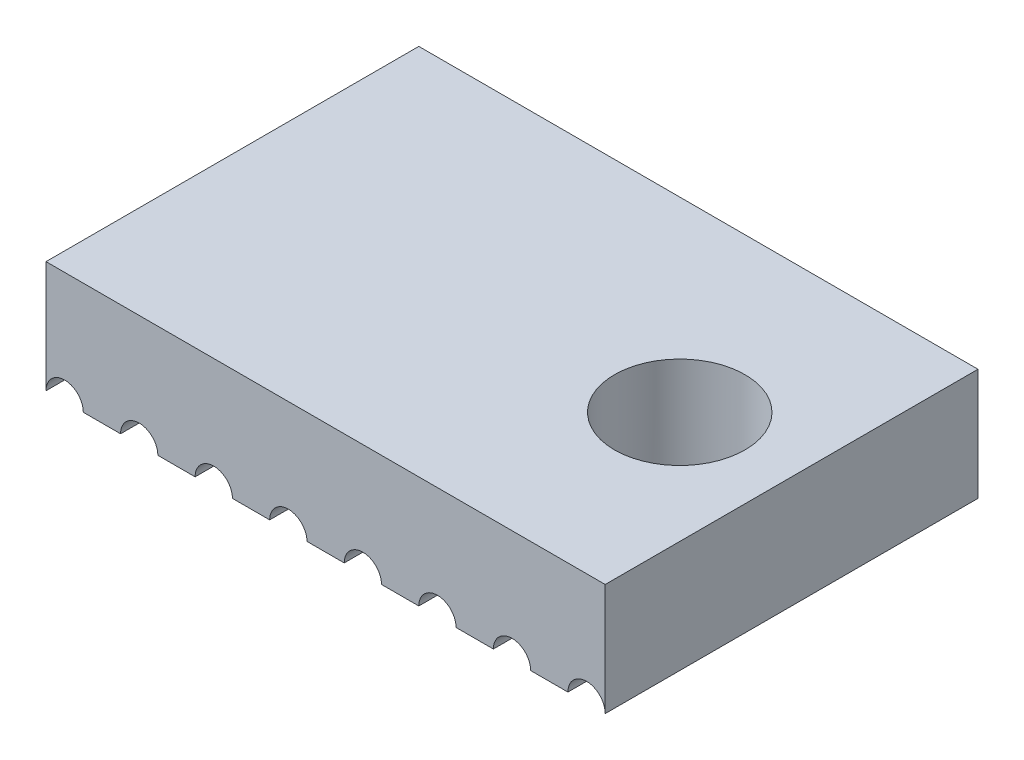
ISO-10303-21;
HEADER;
FILE_DESCRIPTION(('STEP AP214'),'2;1');
FILE_NAME('part.step','',(''),(''),'','','');
FILE_SCHEMA(('AUTOMOTIVE_DESIGN { 1 0 10303 214 1 1 1 1 }'));
ENDSEC;
DATA;
#1=APPLICATION_CONTEXT('core data for automotive mechanical design processes');
#2=APPLICATION_PROTOCOL_DEFINITION('international standard','automotive_design',2000,#1);
#3=PRODUCT_CONTEXT('',#1,'mechanical');
#4=PRODUCT('Part','Part','',(#3));
#5=PRODUCT_RELATED_PRODUCT_CATEGORY('part','',(#4));
#6=PRODUCT_DEFINITION_FORMATION('','',#4);
#7=PRODUCT_DEFINITION_CONTEXT('part definition',#1,'design');
#8=PRODUCT_DEFINITION('design','',#6,#7);
#9=PRODUCT_DEFINITION_SHAPE('','',#8);
#10=(LENGTH_UNIT() NAMED_UNIT(*) SI_UNIT(.MILLI.,.METRE.));
#11=(NAMED_UNIT(*) PLANE_ANGLE_UNIT() SI_UNIT($,.RADIAN.));
#12=(NAMED_UNIT(*) SI_UNIT($,.STERADIAN.) SOLID_ANGLE_UNIT());
#13=UNCERTAINTY_MEASURE_WITH_UNIT(LENGTH_MEASURE(1.E-05),#10,'distance_accuracy_value','');
#14=(GEOMETRIC_REPRESENTATION_CONTEXT(3) GLOBAL_UNCERTAINTY_ASSIGNED_CONTEXT((#13)) GLOBAL_UNIT_ASSIGNED_CONTEXT((#10,
#11,#12)) REPRESENTATION_CONTEXT('',''));
#15=CARTESIAN_POINT('',(0.,0.,0.));
#16=DIRECTION('',(0.,0.,1.));
#17=DIRECTION('',(1.,0.,0.));
#18=AXIS2_PLACEMENT_3D('',#15,#16,#17);
#19=CARTESIAN_POINT('',(0.,0.,0.));
#20=DIRECTION('',(0.,-1.,0.));
#21=DIRECTION('',(0.,0.,-1.));
#22=AXIS2_PLACEMENT_3D('',#19,#20,#21);
#23=PLANE('',#22);
#24=DIRECTION('',(0.,0.,1.));
#25=VECTOR('',#24,1.);
#26=CARTESIAN_POINT('',(-2.5,0.,-5.));
#27=LINE('',#26,#25);
#28=CARTESIAN_POINT('',(-2.5,0.,-5.));
#29=VERTEX_POINT('',#28);
#30=CARTESIAN_POINT('',(-2.5,0.,5.));
#31=VERTEX_POINT('',#30);
#32=EDGE_CURVE('E191',#29,#31,#27,.T.);
#33=ORIENTED_EDGE('',*,*,#32,.F.);
#34=DIRECTION('',(-1.,0.,0.));
#35=VECTOR('',#34,1.);
#36=CARTESIAN_POINT('',(-7.5,0.,-5.));
#37=LINE('',#36,#35);
#38=CARTESIAN_POINT('',(-1.5,0.,-5.));
#39=VERTEX_POINT('',#38);
#40=EDGE_CURVE('E201',#39,#29,#37,.T.);
#41=ORIENTED_EDGE('',*,*,#40,.F.);
#42=DIRECTION('',(0.,0.,1.));
#43=VECTOR('',#42,1.);
#44=CARTESIAN_POINT('',(-1.5,0.,-5.));
#45=LINE('',#44,#43);
#46=CARTESIAN_POINT('',(-1.5,0.,5.));
#47=VERTEX_POINT('',#46);
#48=EDGE_CURVE('E344',#39,#47,#45,.T.);
#49=ORIENTED_EDGE('',*,*,#48,.T.);
#50=DIRECTION('',(1.,0.,0.));
#51=VECTOR('',#50,1.);
#52=CARTESIAN_POINT('',(-7.5,0.,5.));
#53=LINE('',#52,#51);
#54=EDGE_CURVE('E222',#31,#47,#53,.T.);
#55=ORIENTED_EDGE('',*,*,#54,.F.);
#56=EDGE_LOOP('',(#33,#41,#49,#55));
#57=FACE_BOUND('',#56,.T.);
#58=ADVANCED_FACE('F33',(#57),#23,.T.);
#59=DIRECTION('',(0.,0.,1.));
#60=VECTOR('',#59,1.);
#61=CARTESIAN_POINT('',(-0.499999999999997,0.,-5.));
#62=LINE('',#61,#60);
#63=CARTESIAN_POINT('',(-0.499999999999997,0.,-5.));
#64=VERTEX_POINT('',#63);
#65=CARTESIAN_POINT('',(-0.499999999999997,0.,5.));
#66=VERTEX_POINT('',#65);
#67=EDGE_CURVE('E61',#64,#66,#62,.T.);
#68=ORIENTED_EDGE('',*,*,#67,.F.);
#69=CARTESIAN_POINT('',(0.500000000000003,0.,-5.));
#70=VERTEX_POINT('',#69);
#71=EDGE_CURVE('E208',#70,#64,#37,.T.);
#72=ORIENTED_EDGE('',*,*,#71,.F.);
#73=DIRECTION('',(0.,0.,1.));
#74=VECTOR('',#73,1.);
#75=CARTESIAN_POINT('',(0.500000000000003,0.,-5.));
#76=LINE('',#75,#74);
#77=CARTESIAN_POINT('',(0.500000000000003,0.,5.));
#78=VERTEX_POINT('',#77);
#79=EDGE_CURVE('E341',#70,#78,#76,.T.);
#80=ORIENTED_EDGE('',*,*,#79,.T.);
#81=EDGE_CURVE('E343',#66,#78,#53,.T.);
#82=ORIENTED_EDGE('',*,*,#81,.F.);
#83=EDGE_LOOP('',(#68,#72,#80,#82));
#84=FACE_BOUND('',#83,.T.);
#85=ADVANCED_FACE('F277',(#84),#23,.T.);
#86=DIRECTION('',(0.,0.,1.));
#87=VECTOR('',#86,1.);
#88=CARTESIAN_POINT('',(1.5,0.,-5.));
#89=LINE('',#88,#87);
#90=CARTESIAN_POINT('',(1.5,0.,-5.));
#91=VERTEX_POINT('',#90);
#92=CARTESIAN_POINT('',(1.5,0.,5.));
#93=VERTEX_POINT('',#92);
#94=EDGE_CURVE('E53',#91,#93,#89,.T.);
#95=ORIENTED_EDGE('',*,*,#94,.F.);
#96=CARTESIAN_POINT('',(2.5,0.,-5.));
#97=VERTEX_POINT('',#96);
#98=EDGE_CURVE('E330',#97,#91,#37,.T.);
#99=ORIENTED_EDGE('',*,*,#98,.F.);
#100=DIRECTION('',(0.,0.,1.));
#101=VECTOR('',#100,1.);
#102=CARTESIAN_POINT('',(2.5,0.,-5.));
#103=LINE('',#102,#101);
#104=CARTESIAN_POINT('',(2.5,0.,5.));
#105=VERTEX_POINT('',#104);
#106=EDGE_CURVE('E361',#97,#105,#103,.T.);
#107=ORIENTED_EDGE('',*,*,#106,.T.);
#108=EDGE_CURVE('E428',#93,#105,#53,.T.);
#109=ORIENTED_EDGE('',*,*,#108,.F.);
#110=EDGE_LOOP('',(#95,#99,#107,#109));
#111=FACE_BOUND('',#110,.T.);
#112=ADVANCED_FACE('F283',(#111),#23,.T.);
#113=DIRECTION('',(0.,0.,1.));
#114=VECTOR('',#113,1.);
#115=CARTESIAN_POINT('',(3.5,0.,-5.));
#116=LINE('',#115,#114);
#117=CARTESIAN_POINT('',(3.5,0.,-5.));
#118=VERTEX_POINT('',#117);
#119=CARTESIAN_POINT('',(3.5,0.,-1.43614066163451));
#120=VERTEX_POINT('',#119);
#121=EDGE_CURVE('E356',#118,#120,#116,.T.);
#122=ORIENTED_EDGE('',*,*,#121,.F.);
#123=CARTESIAN_POINT('',(4.5,0.,-5.));
#124=VERTEX_POINT('',#123);
#125=EDGE_CURVE('E329',#124,#118,#37,.T.);
#126=ORIENTED_EDGE('',*,*,#125,.F.);
#127=DIRECTION('',(0.,0.,1.));
#128=VECTOR('',#127,1.);
#129=CARTESIAN_POINT('',(4.5,0.,-5.));
#130=LINE('',#129,#128);
#131=CARTESIAN_POINT('',(4.5,0.,-1.75));
#132=VERTEX_POINT('',#131);
#133=EDGE_CURVE('E372',#124,#132,#130,.T.);
#134=ORIENTED_EDGE('',*,*,#133,.T.);
#135=CARTESIAN_POINT('',(4.5,0.,0.));
#136=DIRECTION('',(0.,1.,0.));
#137=DIRECTION('',(0.,0.,1.));
#138=AXIS2_PLACEMENT_3D('',#135,#136,#137);
#139=CIRCLE('',#138,1.75);
#140=EDGE_CURVE('E398',#132,#120,#139,.T.);
#141=ORIENTED_EDGE('',*,*,#140,.T.);
#142=EDGE_LOOP('',(#122,#126,#134,#141));
#143=FACE_BOUND('',#142,.T.);
#144=ADVANCED_FACE('F308',(#143),#23,.T.);
#145=CARTESIAN_POINT('',(3.5,0.,1.43614066163451));
#146=VERTEX_POINT('',#145);
#147=CARTESIAN_POINT('',(3.5,0.,5.));
#148=VERTEX_POINT('',#147);
#149=EDGE_CURVE('E364',#146,#148,#116,.T.);
#150=ORIENTED_EDGE('',*,*,#149,.F.);
#151=CARTESIAN_POINT('',(4.5,0.,1.75));
#152=VERTEX_POINT('',#151);
#153=EDGE_CURVE('E395',#146,#152,#139,.T.);
#154=ORIENTED_EDGE('',*,*,#153,.T.);
#155=CARTESIAN_POINT('',(4.5,0.,5.));
#156=VERTEX_POINT('',#155);
#157=EDGE_CURVE('E368',#152,#156,#130,.T.);
#158=ORIENTED_EDGE('',*,*,#157,.T.);
#159=EDGE_CURVE('E430',#148,#156,#53,.T.);
#160=ORIENTED_EDGE('',*,*,#159,.F.);
#161=EDGE_LOOP('',(#150,#154,#158,#160));
#162=FACE_BOUND('',#161,.T.);
#163=ADVANCED_FACE('F303',(#162),#23,.T.);
#164=DIRECTION('',(0.,0.,1.));
#165=VECTOR('',#164,1.);
#166=CARTESIAN_POINT('',(5.5,0.,-5.));
#167=LINE('',#166,#165);
#168=CARTESIAN_POINT('',(5.5,0.,-5.));
#169=VERTEX_POINT('',#168);
#170=CARTESIAN_POINT('',(5.5,0.,-1.43614066163451));
#171=VERTEX_POINT('',#170);
#172=EDGE_CURVE('E313',#169,#171,#167,.T.);
#173=ORIENTED_EDGE('',*,*,#172,.F.);
#174=CARTESIAN_POINT('',(6.5,0.,-5.));
#175=VERTEX_POINT('',#174);
#176=EDGE_CURVE('E211',#175,#169,#37,.T.);
#177=ORIENTED_EDGE('',*,*,#176,.F.);
#178=DIRECTION('',(0.,0.,1.));
#179=VECTOR('',#178,1.);
#180=CARTESIAN_POINT('',(6.5,0.,-5.));
#181=LINE('',#180,#179);
#182=CARTESIAN_POINT('',(6.5,0.,5.));
#183=VERTEX_POINT('',#182);
#184=EDGE_CURVE('E370',#175,#183,#181,.T.);
#185=ORIENTED_EDGE('',*,*,#184,.T.);
#186=CARTESIAN_POINT('',(5.5,0.,5.));
#187=VERTEX_POINT('',#186);
#188=EDGE_CURVE('E218',#187,#183,#53,.T.);
#189=ORIENTED_EDGE('',*,*,#188,.F.);
#190=CARTESIAN_POINT('',(5.5,0.,1.43614066163451));
#191=VERTEX_POINT('',#190);
#192=EDGE_CURVE('E321',#191,#187,#167,.T.);
#193=ORIENTED_EDGE('',*,*,#192,.F.);
#194=EDGE_CURVE('E318',#191,#171,#139,.T.);
#195=ORIENTED_EDGE('',*,*,#194,.T.);
#196=EDGE_LOOP('',(#173,#177,#185,#189,#193,#195));
#197=FACE_BOUND('',#196,.T.);
#198=ADVANCED_FACE('F297',(#197),#23,.T.);
#199=DIRECTION('',(0.,0.,1.));
#200=VECTOR('',#199,1.);
#201=CARTESIAN_POINT('',(-3.5,0.,-5.));
#202=LINE('',#201,#200);
#203=CARTESIAN_POINT('',(-3.5,0.,-5.));
#204=VERTEX_POINT('',#203);
#205=CARTESIAN_POINT('',(-3.5,0.,5.));
#206=VERTEX_POINT('',#205);
#207=EDGE_CURVE('E180',#204,#206,#202,.T.);
#208=ORIENTED_EDGE('',*,*,#207,.T.);
#209=CARTESIAN_POINT('',(-4.5,0.,5.));
#210=VERTEX_POINT('',#209);
#211=EDGE_CURVE('E219',#210,#206,#53,.T.);
#212=ORIENTED_EDGE('',*,*,#211,.F.);
#213=DIRECTION('',(0.,0.,1.));
#214=VECTOR('',#213,1.);
#215=CARTESIAN_POINT('',(-4.5,0.,-5.));
#216=LINE('',#215,#214);
#217=CARTESIAN_POINT('',(-4.5,0.,-5.));
#218=VERTEX_POINT('',#217);
#219=EDGE_CURVE('E205',#218,#210,#216,.T.);
#220=ORIENTED_EDGE('',*,*,#219,.F.);
#221=EDGE_CURVE('E197',#204,#218,#37,.T.);
#222=ORIENTED_EDGE('',*,*,#221,.F.);
#223=EDGE_LOOP('',(#208,#212,#220,#222));
#224=FACE_BOUND('',#223,.T.);
#225=ADVANCED_FACE('F204',(#224),#23,.T.);
#226=CARTESIAN_POINT('',(7.5,3.,5.));
#227=DIRECTION('',(-1.,0.,0.));
#228=DIRECTION('',(0.,0.,1.));
#229=AXIS2_PLACEMENT_3D('',#226,#227,#228);
#230=PLANE('',#229);
#231=DIRECTION('',(0.,0.,-1.));
#232=VECTOR('',#231,1.);
#233=CARTESIAN_POINT('',(7.5,0.,5.));
#234=LINE('',#233,#232);
#235=CARTESIAN_POINT('',(7.5,0.,5.));
#236=VERTEX_POINT('',#235);
#237=CARTESIAN_POINT('',(7.5,0.,-5.));
#238=VERTEX_POINT('',#237);
#239=EDGE_CURVE('E210',#236,#238,#234,.T.);
#240=ORIENTED_EDGE('',*,*,#239,.T.);
#241=DIRECTION('',(0.,-1.,0.));
#242=VECTOR('',#241,1.);
#243=CARTESIAN_POINT('',(7.5,3.,-5.));
#244=LINE('',#243,#242);
#245=CARTESIAN_POINT('',(7.5,3.,-5.));
#246=VERTEX_POINT('',#245);
#247=EDGE_CURVE('E233',#246,#238,#244,.T.);
#248=ORIENTED_EDGE('',*,*,#247,.F.);
#249=DIRECTION('',(0.,0.,-1.));
#250=VECTOR('',#249,1.);
#251=CARTESIAN_POINT('',(7.5,3.,5.));
#252=LINE('',#251,#250);
#253=CARTESIAN_POINT('',(7.5,3.,5.));
#254=VERTEX_POINT('',#253);
#255=EDGE_CURVE('E401',#254,#246,#252,.T.);
#256=ORIENTED_EDGE('',*,*,#255,.F.);
#257=DIRECTION('',(0.,-1.,0.));
#258=VECTOR('',#257,1.);
#259=CARTESIAN_POINT('',(7.5,3.,5.));
#260=LINE('',#259,#258);
#261=EDGE_CURVE('E223',#254,#236,#260,.T.);
#262=ORIENTED_EDGE('',*,*,#261,.T.);
#263=EDGE_LOOP('',(#240,#248,#256,#262));
#264=FACE_BOUND('',#263,.T.);
#265=ADVANCED_FACE('F35',(#264),#230,.F.);
#266=CARTESIAN_POINT('',(-7.5,3.,-5.));
#267=DIRECTION('',(0.,0.,1.));
#268=DIRECTION('',(1.,0.,0.));
#269=AXIS2_PLACEMENT_3D('',#266,#267,#268);
#270=PLANE('',#269);
#271=ORIENTED_EDGE('',*,*,#40,.T.);
#272=CARTESIAN_POINT('',(-3.,0.,-5.));
#273=DIRECTION('',(0.,0.,1.));
#274=DIRECTION('',(-1.,0.,0.));
#275=AXIS2_PLACEMENT_3D('',#272,#273,#274);
#276=CIRCLE('',#275,0.5);
#277=EDGE_CURVE('E183',#29,#204,#276,.T.);
#278=ORIENTED_EDGE('',*,*,#277,.T.);
#279=ORIENTED_EDGE('',*,*,#221,.T.);
#280=CARTESIAN_POINT('',(-5.,0.,-5.));
#281=DIRECTION('',(0.,0.,1.));
#282=DIRECTION('',(-1.,0.,0.));
#283=AXIS2_PLACEMENT_3D('',#280,#281,#282);
#284=CIRCLE('',#283,0.5);
#285=CARTESIAN_POINT('',(-5.5,0.,-5.));
#286=VERTEX_POINT('',#285);
#287=EDGE_CURVE('E387',#218,#286,#284,.T.);
#288=ORIENTED_EDGE('',*,*,#287,.T.);
#289=CARTESIAN_POINT('',(-6.5,0.,-5.));
#290=VERTEX_POINT('',#289);
#291=EDGE_CURVE('E206',#286,#290,#37,.T.);
#292=ORIENTED_EDGE('',*,*,#291,.T.);
#293=CARTESIAN_POINT('',(-7.,0.,-5.));
#294=DIRECTION('',(0.,0.,1.));
#295=DIRECTION('',(-1.,0.,0.));
#296=AXIS2_PLACEMENT_3D('',#293,#294,#295);
#297=CIRCLE('',#296,0.5);
#298=CARTESIAN_POINT('',(-7.5,0.,-5.));
#299=VERTEX_POINT('',#298);
#300=EDGE_CURVE('E379',#290,#299,#297,.T.);
#301=ORIENTED_EDGE('',*,*,#300,.T.);
#302=DIRECTION('',(0.,-1.,0.));
#303=VECTOR('',#302,1.);
#304=CARTESIAN_POINT('',(-7.5,3.,-5.));
#305=LINE('',#304,#303);
#306=CARTESIAN_POINT('',(-7.5,3.,-5.));
#307=VERTEX_POINT('',#306);
#308=EDGE_CURVE('E230',#307,#299,#305,.T.);
#309=ORIENTED_EDGE('',*,*,#308,.F.);
#310=DIRECTION('',(-1.,0.,0.));
#311=VECTOR('',#310,1.);
#312=CARTESIAN_POINT('',(-7.5,3.,-5.));
#313=LINE('',#312,#311);
#314=EDGE_CURVE('E404',#246,#307,#313,.T.);
#315=ORIENTED_EDGE('',*,*,#314,.F.);
#316=ORIENTED_EDGE('',*,*,#247,.T.);
#317=CARTESIAN_POINT('',(7.,0.,-5.));
#318=DIRECTION('',(0.,0.,1.));
#319=DIRECTION('',(-1.,0.,0.));
#320=AXIS2_PLACEMENT_3D('',#317,#318,#319);
#321=CIRCLE('',#320,0.5);
#322=EDGE_CURVE('E328',#238,#175,#321,.T.);
#323=ORIENTED_EDGE('',*,*,#322,.T.);
#324=ORIENTED_EDGE('',*,*,#176,.T.);
#325=CARTESIAN_POINT('',(5.,0.,-5.));
#326=DIRECTION('',(0.,0.,1.));
#327=DIRECTION('',(-1.,0.,0.));
#328=AXIS2_PLACEMENT_3D('',#325,#326,#327);
#329=CIRCLE('',#328,0.5);
#330=EDGE_CURVE('E326',#169,#124,#329,.T.);
#331=ORIENTED_EDGE('',*,*,#330,.T.);
#332=ORIENTED_EDGE('',*,*,#125,.T.);
#333=CARTESIAN_POINT('',(3.,0.,-5.));
#334=DIRECTION('',(0.,0.,1.));
#335=DIRECTION('',(-1.,0.,0.));
#336=AXIS2_PLACEMENT_3D('',#333,#334,#335);
#337=CIRCLE('',#336,0.5);
#338=EDGE_CURVE('E359',#118,#97,#337,.T.);
#339=ORIENTED_EDGE('',*,*,#338,.T.);
#340=ORIENTED_EDGE('',*,*,#98,.T.);
#341=CARTESIAN_POINT('',(1.,0.,-5.));
#342=DIRECTION('',(0.,0.,1.));
#343=DIRECTION('',(-1.,0.,0.));
#344=AXIS2_PLACEMENT_3D('',#341,#342,#343);
#345=CIRCLE('',#344,0.5);
#346=EDGE_CURVE('E338',#91,#70,#345,.T.);
#347=ORIENTED_EDGE('',*,*,#346,.T.);
#348=ORIENTED_EDGE('',*,*,#71,.T.);
#349=CARTESIAN_POINT('',(-0.999999999999997,0.,-5.));
#350=DIRECTION('',(0.,0.,1.));
#351=DIRECTION('',(-1.,0.,0.));
#352=AXIS2_PLACEMENT_3D('',#349,#350,#351);
#353=CIRCLE('',#352,0.5);
#354=EDGE_CURVE('E337',#64,#39,#353,.T.);
#355=ORIENTED_EDGE('',*,*,#354,.T.);
#356=EDGE_LOOP('',(#271,#278,#279,#288,#292,#301,#309,#315,#316,#323,#324,#331,#332,#339,#340,
#347,#348,#355));
#357=FACE_BOUND('',#356,.T.);
#358=ADVANCED_FACE('F195',(#357),#270,.F.);
#359=CARTESIAN_POINT('',(-7.5,3.,5.));
#360=DIRECTION('',(1.,0.,0.));
#361=DIRECTION('',(0.,0.,-1.));
#362=AXIS2_PLACEMENT_3D('',#359,#360,#361);
#363=PLANE('',#362);
#364=DIRECTION('',(0.,0.,1.));
#365=VECTOR('',#364,1.);
#366=CARTESIAN_POINT('',(-7.5,0.,5.));
#367=LINE('',#366,#365);
#368=CARTESIAN_POINT('',(-7.5,0.,5.));
#369=VERTEX_POINT('',#368);
#370=EDGE_CURVE('E215',#299,#369,#367,.T.);
#371=ORIENTED_EDGE('',*,*,#370,.T.);
#372=DIRECTION('',(0.,-1.,0.));
#373=VECTOR('',#372,1.);
#374=CARTESIAN_POINT('',(-7.5,3.,5.));
#375=LINE('',#374,#373);
#376=CARTESIAN_POINT('',(-7.5,3.,5.));
#377=VERTEX_POINT('',#376);
#378=EDGE_CURVE('E226',#377,#369,#375,.T.);
#379=ORIENTED_EDGE('',*,*,#378,.F.);
#380=DIRECTION('',(0.,0.,1.));
#381=VECTOR('',#380,1.);
#382=CARTESIAN_POINT('',(-7.5,3.,5.));
#383=LINE('',#382,#381);
#384=EDGE_CURVE('E406',#307,#377,#383,.T.);
#385=ORIENTED_EDGE('',*,*,#384,.F.);
#386=ORIENTED_EDGE('',*,*,#308,.T.);
#387=EDGE_LOOP('',(#371,#379,#385,#386));
#388=FACE_BOUND('',#387,.T.);
#389=ADVANCED_FACE('F420',(#388),#363,.F.);
#390=CARTESIAN_POINT('',(-7.5,3.,5.));
#391=DIRECTION('',(0.,0.,-1.));
#392=DIRECTION('',(-1.,0.,0.));
#393=AXIS2_PLACEMENT_3D('',#390,#391,#392);
#394=PLANE('',#393);
#395=ORIENTED_EDGE('',*,*,#211,.T.);
#396=CARTESIAN_POINT('',(-3.,0.,5.));
#397=DIRECTION('',(0.,0.,1.));
#398=DIRECTION('',(-1.,0.,0.));
#399=AXIS2_PLACEMENT_3D('',#396,#397,#398);
#400=CIRCLE('',#399,0.5);
#401=EDGE_CURVE('E186',#31,#206,#400,.T.);
#402=ORIENTED_EDGE('',*,*,#401,.F.);
#403=ORIENTED_EDGE('',*,*,#54,.T.);
#404=CARTESIAN_POINT('',(-0.999999999999997,0.,5.));
#405=DIRECTION('',(0.,0.,1.));
#406=DIRECTION('',(-1.,0.,0.));
#407=AXIS2_PLACEMENT_3D('',#404,#405,#406);
#408=CIRCLE('',#407,0.5);
#409=EDGE_CURVE('E350',#66,#47,#408,.T.);
#410=ORIENTED_EDGE('',*,*,#409,.F.);
#411=ORIENTED_EDGE('',*,*,#81,.T.);
#412=CARTESIAN_POINT('',(1.,0.,5.));
#413=DIRECTION('',(0.,0.,1.));
#414=DIRECTION('',(-1.,0.,0.));
#415=AXIS2_PLACEMENT_3D('',#412,#413,#414);
#416=CIRCLE('',#415,0.5);
#417=EDGE_CURVE('E354',#93,#78,#416,.T.);
#418=ORIENTED_EDGE('',*,*,#417,.F.);
#419=ORIENTED_EDGE('',*,*,#108,.T.);
#420=CARTESIAN_POINT('',(3.,0.,5.));
#421=DIRECTION('',(0.,0.,1.));
#422=DIRECTION('',(-1.,0.,0.));
#423=AXIS2_PLACEMENT_3D('',#420,#421,#422);
#424=CIRCLE('',#423,0.5);
#425=EDGE_CURVE('E320',#148,#105,#424,.T.);
#426=ORIENTED_EDGE('',*,*,#425,.F.);
#427=ORIENTED_EDGE('',*,*,#159,.T.);
#428=CARTESIAN_POINT('',(5.,0.,5.));
#429=DIRECTION('',(0.,0.,1.));
#430=DIRECTION('',(-1.,0.,0.));
#431=AXIS2_PLACEMENT_3D('',#428,#429,#430);
#432=CIRCLE('',#431,0.5);
#433=EDGE_CURVE('E369',#187,#156,#432,.T.);
#434=ORIENTED_EDGE('',*,*,#433,.F.);
#435=ORIENTED_EDGE('',*,*,#188,.T.);
#436=CARTESIAN_POINT('',(7.,0.,5.));
#437=DIRECTION('',(0.,0.,1.));
#438=DIRECTION('',(-1.,0.,0.));
#439=AXIS2_PLACEMENT_3D('',#436,#437,#438);
#440=CIRCLE('',#439,0.5);
#441=EDGE_CURVE('E376',#236,#183,#440,.T.);
#442=ORIENTED_EDGE('',*,*,#441,.F.);
#443=ORIENTED_EDGE('',*,*,#261,.F.);
#444=DIRECTION('',(1.,0.,0.));
#445=VECTOR('',#444,1.);
#446=CARTESIAN_POINT('',(-7.5,3.,5.));
#447=LINE('',#446,#445);
#448=EDGE_CURVE('E227',#377,#254,#447,.T.);
#449=ORIENTED_EDGE('',*,*,#448,.F.);
#450=ORIENTED_EDGE('',*,*,#378,.T.);
#451=CARTESIAN_POINT('',(-7.,0.,5.));
#452=DIRECTION('',(0.,0.,1.));
#453=DIRECTION('',(-1.,0.,0.));
#454=AXIS2_PLACEMENT_3D('',#451,#452,#453);
#455=CIRCLE('',#454,0.5);
#456=CARTESIAN_POINT('',(-6.5,0.,5.));
#457=VERTEX_POINT('',#456);
#458=EDGE_CURVE('E383',#457,#369,#455,.T.);
#459=ORIENTED_EDGE('',*,*,#458,.F.);
#460=CARTESIAN_POINT('',(-5.5,0.,5.));
#461=VERTEX_POINT('',#460);
#462=EDGE_CURVE('E221',#457,#461,#53,.T.);
#463=ORIENTED_EDGE('',*,*,#462,.T.);
#464=CARTESIAN_POINT('',(-5.,0.,5.));
#465=DIRECTION('',(0.,0.,1.));
#466=DIRECTION('',(-1.,0.,0.));
#467=AXIS2_PLACEMENT_3D('',#464,#465,#466);
#468=CIRCLE('',#467,0.5);
#469=EDGE_CURVE('E390',#210,#461,#468,.T.);
#470=ORIENTED_EDGE('',*,*,#469,.F.);
#471=EDGE_LOOP('',(#395,#402,#403,#410,#411,#418,#419,#426,#427,#434,#435,#442,#443,#449,#450,
#459,#463,#470));
#472=FACE_BOUND('',#471,.T.);
#473=ADVANCED_FACE('F293',(#472),#394,.F.);
#474=CARTESIAN_POINT('',(0.,3.,0.));
#475=DIRECTION('',(0.,-1.,0.));
#476=DIRECTION('',(0.,0.,-1.));
#477=AXIS2_PLACEMENT_3D('',#474,#475,#476);
#478=PLANE('',#477);
#479=CARTESIAN_POINT('',(4.5,3.,0.));
#480=DIRECTION('',(0.,1.,0.));
#481=DIRECTION('',(0.,0.,1.));
#482=AXIS2_PLACEMENT_3D('',#479,#480,#481);
#483=CIRCLE('',#482,1.75);
#484=CARTESIAN_POINT('',(4.5,3.,1.75));
#485=VERTEX_POINT('',#484);
#486=EDGE_CURVE('E386',#485,#485,#483,.T.);
#487=ORIENTED_EDGE('',*,*,#486,.F.);
#488=EDGE_LOOP('',(#487));
#489=FACE_BOUND('',#488,.T.);
#490=ORIENTED_EDGE('',*,*,#255,.T.);
#491=ORIENTED_EDGE('',*,*,#314,.T.);
#492=ORIENTED_EDGE('',*,*,#384,.T.);
#493=ORIENTED_EDGE('',*,*,#448,.T.);
#494=EDGE_LOOP('',(#490,#491,#492,#493));
#495=FACE_BOUND('',#494,.T.);
#496=ADVANCED_FACE('F287',(#489,#495),#478,.F.);
#497=DIRECTION('',(0.,0.,1.));
#498=VECTOR('',#497,1.);
#499=CARTESIAN_POINT('',(-6.5,0.,-5.));
#500=LINE('',#499,#498);
#501=EDGE_CURVE('E382',#290,#457,#500,.T.);
#502=ORIENTED_EDGE('',*,*,#501,.F.);
#503=ORIENTED_EDGE('',*,*,#291,.F.);
#504=DIRECTION('',(0.,0.,1.));
#505=VECTOR('',#504,1.);
#506=CARTESIAN_POINT('',(-5.5,0.,-5.));
#507=LINE('',#506,#505);
#508=EDGE_CURVE('E389',#286,#461,#507,.T.);
#509=ORIENTED_EDGE('',*,*,#508,.T.);
#510=ORIENTED_EDGE('',*,*,#462,.F.);
#511=EDGE_LOOP('',(#502,#503,#509,#510));
#512=FACE_BOUND('',#511,.T.);
#513=ADVANCED_FACE('F274',(#512),#23,.T.);
#514=CARTESIAN_POINT('',(4.5,0.,0.));
#515=DIRECTION('',(0.,1.,0.));
#516=DIRECTION('',(0.,0.,1.));
#517=AXIS2_PLACEMENT_3D('',#514,#515,#516);
#518=CYLINDRICAL_SURFACE('',#517,1.75);
#519=ORIENTED_EDGE('',*,*,#153,.F.);
#520=CARTESIAN_POINT('',(3.5,0.,1.43614066163451));
#521=CARTESIAN_POINT('',(3.50003507961647,0.0239539993863725,1.43614757630099));
#522=CARTESIAN_POINT('',(3.49828087523016,0.0478872725717558,1.4349435561475));
#523=CARTESIAN_POINT('',(3.4914656514043,0.0949479208351667,1.43017090494755));
#524=CARTESIAN_POINT('',(3.48641695766582,0.118077962669881,1.42661108696801));
#525=CARTESIAN_POINT('',(3.47328330587341,0.162947662814521,1.41718514143364));
#526=CARTESIAN_POINT('',(3.4651994703287,0.184687831677185,1.41131986648565));
#527=CARTESIAN_POINT('',(3.44645614951036,0.226267190948943,1.39738406063937));
#528=CARTESIAN_POINT('',(3.43579552319815,0.246105533752782,1.3893125525828));
#529=CARTESIAN_POINT('',(3.41203155641908,0.284167863781784,1.3707874269073));
#530=CARTESIAN_POINT('',(3.3988548583218,0.302309403158748,1.36025933459833));
#531=CARTESIAN_POINT('',(3.37097182461153,0.335943586754634,1.33720743573744));
#532=CARTESIAN_POINT('',(3.35626473592543,0.351434916853136,1.32468264502398));
#533=CARTESIAN_POINT('',(3.31970395307907,0.385544183378387,1.29236601406151));
#534=CARTESIAN_POINT('',(3.29739052472362,0.402843616781754,1.27169894754331));
#535=CARTESIAN_POINT('',(3.25231971467965,0.432511795270322,1.22751695273404));
#536=CARTESIAN_POINT('',(3.22956157232122,0.444871141439641,1.20399670576424));
#537=CARTESIAN_POINT('',(3.17491372572898,0.469740264420735,1.14407707669424));
#538=CARTESIAN_POINT('',(3.14331514020877,0.480019747038239,1.10649540064593));
#539=CARTESIAN_POINT('',(3.08292954580931,0.49405075793893,1.02804940864038));
#540=CARTESIAN_POINT('',(3.0541481204656,0.49778956057849,0.987178854951376));
#541=CARTESIAN_POINT('',(2.98334271271442,0.501652061824026,0.876821065195189));
#542=CARTESIAN_POINT('',(2.94423013438605,0.49807584827551,0.805359425704186));
#543=CARTESIAN_POINT('',(2.87638504854349,0.485703126952787,0.658031309648407));
#544=CARTESIAN_POINT('',(2.84768367629487,0.476891165337653,0.582152395534535));
#545=CARTESIAN_POINT('',(2.81180931696655,0.463423577627223,0.463035114286135));
#546=CARTESIAN_POINT('',(2.8008173417553,0.458729374923992,0.420920140533017));
#547=CARTESIAN_POINT('',(2.78199174502047,0.450089497091344,0.335919514072822));
#548=CARTESIAN_POINT('',(2.77415699880866,0.446143555677192,0.293034141498857));
#549=CARTESIAN_POINT('',(2.76172233932755,0.439628429555035,0.206833905299723));
#550=CARTESIAN_POINT('',(2.75711188625253,0.437054765662874,0.163520914874995));
#551=CARTESIAN_POINT('',(2.75113493288907,0.433679873403531,0.0766034779977167));
#552=CARTESIAN_POINT('',(2.74976810156258,0.432878464163879,0.0329990617430918));
#553=CARTESIAN_POINT('',(2.75031106684332,0.43319266427798,-0.0566700078088571));
#554=CARTESIAN_POINT('',(2.75241206625975,0.434420144065979,-0.102733228124655));
#555=CARTESIAN_POINT('',(2.76022875911997,0.438781456172238,-0.194463655426593));
#556=CARTESIAN_POINT('',(2.76594519761425,0.441915681417403,-0.240130778820375));
#557=CARTESIAN_POINT('',(2.78096677080576,0.449550095997173,-0.330993646664573));
#558=CARTESIAN_POINT('',(2.79029040593447,0.454057301247043,-0.37618570677213));
#559=CARTESIAN_POINT('',(2.81246193819923,0.463654145614783,-0.465662478024863));
#560=CARTESIAN_POINT('',(2.82531223279234,0.468744179568453,-0.509946549821853));
#561=CARTESIAN_POINT('',(2.85469879504666,0.478677116939054,-0.598057831398255));
#562=CARTESIAN_POINT('',(2.87128775932934,0.483515131943627,-0.641868062524535));
#563=CARTESIAN_POINT('',(2.90797882298523,0.491819046040461,-0.728123270665004));
#564=CARTESIAN_POINT('',(2.92807983462228,0.495285368885219,-0.770568665585074));
#565=CARTESIAN_POINT('',(2.97155197225611,0.499665002946768,-0.853536373831188));
#566=CARTESIAN_POINT('',(2.99489958929625,0.50059575654967,-0.894069931130388));
#567=CARTESIAN_POINT('',(3.0447096965446,0.498619488362253,-0.973036612425024));
#568=CARTESIAN_POINT('',(3.07116656530814,0.49571929845521,-1.01147334859766));
#569=CARTESIAN_POINT('',(3.12119759028914,0.485620347394703,-1.07832654763056));
#570=CARTESIAN_POINT('',(3.14431279367865,0.47938101782841,-1.10722525692944));
#571=CARTESIAN_POINT('',(3.19168196967994,0.462482835775616,-1.16281353008681));
#572=CARTESIAN_POINT('',(3.21593692466521,0.451820106339678,-1.1895011313111));
#573=CARTESIAN_POINT('',(3.26490918010095,0.424984968048738,-1.24028564843265));
#574=CARTESIAN_POINT('',(3.28962849785783,0.408746402884287,-1.26434666107518));
#575=CARTESIAN_POINT('',(3.33762799211964,0.370066369804627,-1.30860655665818));
#576=CARTESIAN_POINT('',(3.36091203926595,0.347642566033181,-1.32881616481152));
#577=CARTESIAN_POINT('',(3.39709739051154,0.304686388845402,-1.35885053858257));
#578=CARTESIAN_POINT('',(3.41094497889516,0.285822505069812,-1.36993353224594));
#579=CARTESIAN_POINT('',(3.43628013433742,0.245411537373223,-1.3896969298135));
#580=CARTESIAN_POINT('',(3.44776795019361,0.22386473670493,-1.39837758703643));
#581=CARTESIAN_POINT('',(3.46773344874301,0.178450078751333,-1.41318169599672));
#582=CARTESIAN_POINT('',(3.47619488614389,0.154570545902844,-1.4192913770176));
#583=CARTESIAN_POINT('',(3.48944612948598,0.105309113760723,-1.42875769520306));
#584=CARTESIAN_POINT('',(3.49424222580492,0.0799298692712932,-1.43211904968114));
#585=CARTESIAN_POINT('',(3.49803011984968,0.0452639360826711,-1.43476726697044));
#586=CARTESIAN_POINT('',(3.49876868899996,0.0362268467025018,-1.43528260197907));
#587=CARTESIAN_POINT('',(3.49975299102553,0.0181280594059881,-1.43596878697476));
#588=CARTESIAN_POINT('',(3.49999954883578,0.00906642823230691,-1.43614021358133));
#589=CARTESIAN_POINT('',(3.50000000000014,2.30414179921556E-13,-1.43614066163733));
#590=B_SPLINE_CURVE_WITH_KNOTS('',3,(#520,#521,#522,#523,#524,#525,#526,#527,#528,#529,#530,
#531,#532,#533,#534,#535,#536,#537,#538,#539,#540,#541,#542,#543,#544,#545,#546,#547,#548,#549,
#550,#551,#552,#553,#554,#555,#556,#557,#558,#559,#560,#561,#562,#563,#564,#565,#566,#567,#568,
#569,#570,#571,#572,#573,#574,#575,#576,#577,#578,#579,#580,#581,#582,#583,#584,#585,#586,#587,
#588,#589),.UNSPECIFIED.,.F.,.F.,(4,2,2,2,2,2,2,2,2,2,2,2,2,2,2,2,2,2,2,2,2,2,2,2,2,2,2,2,2,2,2,
2,2,2,4),(0.,0.071735343855141,0.143203830638911,0.214645911691552,0.286119686429231,
0.360134017378152,0.434184943018667,0.538568266450981,0.643149252934575,0.792797129428569,
0.942735840573528,1.18602409948264,1.43003404068719,1.56126304387972,1.69244525842933,
1.82319662487065,1.95393464649481,2.09212451375075,2.23034286772359,2.36927971368491,
2.5083112452166,2.6494408217447,2.79052676546146,2.93063968712127,3.07050307652451,
3.18281184672324,3.29521926014878,3.40900929369078,3.52247766521944,3.59984127316807,
3.67719672025997,3.75496138289668,3.8325922859601,3.85982274847988,3.88700751632492),.UNSPECIFIED.);
#591=EDGE_CURVE('E11',#146,#120,#590,.T.);
#592=ORIENTED_EDGE('',*,*,#591,.T.);
#593=ORIENTED_EDGE('',*,*,#140,.F.);
#594=CARTESIAN_POINT('',(4.5,0.,-1.75));
#595=CARTESIAN_POINT('',(4.49997614220782,0.0281049635425535,-1.74998073530025));
#596=CARTESIAN_POINT('',(4.50236824873608,0.056203041812045,-1.74999967376606));
#597=CARTESIAN_POINT('',(4.51180963843954,0.111590787503583,-1.74997160727267));
#598=CARTESIAN_POINT('',(4.51885638395479,0.138880886961437,-1.74992463822986));
#599=CARTESIAN_POINT('',(4.53743744327215,0.191904030204693,-1.7496226181094));
#600=CARTESIAN_POINT('',(4.54897407104744,0.217636263189751,-1.74936745966164));
#601=CARTESIAN_POINT('',(4.57619329413032,0.266789026562271,-1.74839370183821));
#602=CARTESIAN_POINT('',(4.59187487990076,0.290210117941483,-1.74767521524847));
#603=CARTESIAN_POINT('',(4.62686473258402,0.33399514955497,-1.74548281075504));
#604=CARTESIAN_POINT('',(4.64616035458693,0.354369316481896,-1.74401149668947));
#605=CARTESIAN_POINT('',(4.68782364195643,0.391568136085886,-1.74001701788163));
#606=CARTESIAN_POINT('',(4.71019131260827,0.408392782656111,-1.73749385132972));
#607=CARTESIAN_POINT('',(4.75695283252803,0.437813330890079,-1.73119127141581));
#608=CARTESIAN_POINT('',(4.78131410588169,0.45046488972168,-1.72742985264391));
#609=CARTESIAN_POINT('',(4.83154776020541,0.471556837411184,-1.71849532556794));
#610=CARTESIAN_POINT('',(4.85741994485742,0.479997772016448,-1.71332240034656));
#611=CARTESIAN_POINT('',(4.90980127883947,0.492531942306168,-1.70155264859417));
#612=CARTESIAN_POINT('',(4.9363085518384,0.496636677278,-1.69495964426312));
#613=CARTESIAN_POINT('',(4.9892706219407,0.500590248216291,-1.68043710179536));
#614=CARTESIAN_POINT('',(5.01572540674473,0.500438182876189,-1.67250728096331));
#615=CARTESIAN_POINT('',(5.06901908696108,0.495965151347929,-1.6551541678038));
#616=CARTESIAN_POINT('',(5.09582706962794,0.491468504802623,-1.6456819680523));
#617=CARTESIAN_POINT('',(5.14805125838233,0.478337332279808,-1.62582635470354));
#618=CARTESIAN_POINT('',(5.1734670472802,0.469701573438528,-1.61544267036739));
#619=CARTESIAN_POINT('',(5.22442381551795,0.447733782436832,-1.59328072596198));
#620=CARTESIAN_POINT('',(5.24980477666768,0.434075219848359,-1.58145788409754));
#621=CARTESIAN_POINT('',(5.2978651461368,0.402619262638526,-1.557764601255));
#622=CARTESIAN_POINT('',(5.32054208223713,0.384818123788934,-1.54589412682073));
#623=CARTESIAN_POINT('',(5.36385784498492,0.344290491383709,-1.52213433366046));
#624=CARTESIAN_POINT('',(5.38431235795515,0.321344602653604,-1.51028091790605));
#625=CARTESIAN_POINT('',(5.42095107175818,0.271572606097822,-1.4882227007187));
#626=CARTESIAN_POINT('',(5.43714058451909,0.244751389996869,-1.47801585473722));
#627=CARTESIAN_POINT('',(5.46119478741188,0.194622783332114,-1.46244963252657));
#628=CARTESIAN_POINT('',(5.47012401562914,0.172002439867457,-1.45651472189145));
#629=CARTESIAN_POINT('',(5.48465524233717,0.12531318830915,-1.44673140055051));
#630=CARTESIAN_POINT('',(5.49026520288839,0.101247900407821,-1.4428779987963));
#631=CARTESIAN_POINT('',(5.4960349728493,0.0641403653580868,-1.43889529245018));
#632=CARTESIAN_POINT('',(5.49751845365241,0.0513845851024514,-1.43786620600021));
#633=CARTESIAN_POINT('',(5.49950183701197,0.0257551592197413,-1.43648762711953));
#634=CARTESIAN_POINT('',(5.50000132354639,0.0128814660502882,-1.43613842213601));
#635=CARTESIAN_POINT('',(5.5,0.,-1.43614066163451));
#636=B_SPLINE_CURVE_WITH_KNOTS('',3,(#594,#595,#596,#597,#598,#599,#600,#601,#602,#603,#604,
#605,#606,#607,#608,#609,#610,#611,#612,#613,#614,#615,#616,#617,#618,#619,#620,#621,#622,#623,
#624,#625,#626,#627,#628,#629,#630,#631,#632,#633,#634,#635),.UNSPECIFIED.,.F.,.F.,(4,2,2,2,2,2,
2,2,2,2,2,2,2,2,2,2,2,2,2,2,4),(0.,0.0842035030145912,0.168361137018124,0.252562201322784,
0.336742776662113,0.420634141465201,0.504525650599593,0.587248205440901,0.66996003566006,
0.752451965192293,0.834961361148634,0.920953121055649,1.00697051014668,1.10002829292937,
1.19317051404062,1.29150965019312,1.38972572262185,1.46452315402799,1.53914043069704,
1.57773937547757,1.61635463597029),.UNSPECIFIED.);
#637=EDGE_CURVE('E46',#132,#171,#636,.T.);
#638=ORIENTED_EDGE('',*,*,#637,.T.);
#639=ORIENTED_EDGE('',*,*,#194,.F.);
#640=CARTESIAN_POINT('',(5.5,0.,1.43614066163451));
#641=CARTESIAN_POINT('',(5.50003417006247,0.0251102881648132,1.43609768701878));
#642=CARTESIAN_POINT('',(5.49811120421359,0.0501674547594816,1.43745632089487));
#643=CARTESIAN_POINT('',(5.49065322232871,0.0993152034907097,1.44261587765272));
#644=CARTESIAN_POINT('',(5.48514243518899,0.123411126834833,1.44640041554776));
#645=CARTESIAN_POINT('',(5.47081989606413,0.170078239697788,1.45604878841458));
#646=CARTESIAN_POINT('',(5.46201551246687,0.192652700950215,1.46190798044634));
#647=CARTESIAN_POINT('',(5.44147786099695,0.235949357908267,1.47521867326271));
#648=CARTESIAN_POINT('',(5.42973976071794,0.256668420156209,1.48267279827013));
#649=CARTESIAN_POINT('',(5.40251751066675,0.297725343863025,1.49941288663468));
#650=CARTESIAN_POINT('',(5.38679033060281,0.317858627713978,1.5088036250645));
#651=CARTESIAN_POINT('',(5.35269116795051,0.355318253891369,1.52833386260987));
#652=CARTESIAN_POINT('',(5.33431829568789,0.372643647818629,1.5384736130369));
#653=CARTESIAN_POINT('',(5.29222946524575,0.406749100847736,1.56061556827906));
#654=CARTESIAN_POINT('',(5.26812689066458,0.423025864465053,1.5726622979761));
#655=CARTESIAN_POINT('',(5.21735041282759,0.451223406646953,1.59646331979068));
#656=CARTESIAN_POINT('',(5.19067538609575,0.463142270983472,1.60821748128872));
#657=CARTESIAN_POINT('',(5.13416151045258,0.482628542071705,1.63135172407152));
#658=CARTESIAN_POINT('',(5.10423698686448,0.489993034492268,1.6426955811457));
#659=CARTESIAN_POINT('',(5.04304223749729,0.499101921425198,1.66392662034032));
#660=CARTESIAN_POINT('',(5.0117727069439,0.500849184897473,1.67381454360539));
#661=CARTESIAN_POINT('',(4.95106794814995,0.498462436591177,1.69114350017276));
#662=CARTESIAN_POINT('',(4.92165205690138,0.494719053415554,1.69870496178037));
#663=CARTESIAN_POINT('',(4.86358043406044,0.481946149485958,1.71207353242085));
#664=CARTESIAN_POINT('',(4.83492431982466,0.472919344569914,1.71788154045837));
#665=CARTESIAN_POINT('',(4.78159335969115,0.450631708375049,1.7273920772963));
#666=CARTESIAN_POINT('',(4.75678186797358,0.437750543749749,1.73122231959604));
#667=CARTESIAN_POINT('',(4.70954055837585,0.407937488265901,1.73757334972886));
#668=CARTESIAN_POINT('',(4.68711042706445,0.391006131444543,1.74009431005817));
#669=CARTESIAN_POINT('',(4.64583663444675,0.354004453695029,1.74403347565767));
#670=CARTESIAN_POINT('',(4.62692238668337,0.33401522918328,1.74547569648761));
#671=CARTESIAN_POINT('',(4.59260860573245,0.291179243104538,1.74763268197686));
#672=CARTESIAN_POINT('',(4.5772097164652,0.268331959201524,1.74834731344394));
#673=CARTESIAN_POINT('',(4.55020095033261,0.220122726824571,1.74933285588081));
#674=CARTESIAN_POINT('',(4.53863993765123,0.194733337517212,1.74959820876042));
#675=CARTESIAN_POINT('',(4.51990122053655,0.142394607287462,1.74991217722347));
#676=CARTESIAN_POINT('',(4.51272003012006,0.115446525711812,1.74996096536954));
#677=CARTESIAN_POINT('',(4.50521986602873,0.0735649619420953,1.74999396903731));
#678=CARTESIAN_POINT('',(4.50326227133687,0.0589069149300201,1.74999771302592));
#679=CARTESIAN_POINT('',(4.50065340895063,0.0295013946070949,1.75000009804147));
#680=CARTESIAN_POINT('',(4.4999998156703,0.014754127629255,1.74999874816538));
#681=CARTESIAN_POINT('',(4.5,0.,1.75));
#682=B_SPLINE_CURVE_WITH_KNOTS('',3,(#640,#641,#642,#643,#644,#645,#646,#647,#648,#649,#650,
#651,#652,#653,#654,#655,#656,#657,#658,#659,#660,#661,#662,#663,#664,#665,#666,#667,#668,#669,
#670,#671,#672,#673,#674,#675,#676,#677,#678,#679,#680,#681),.UNSPECIFIED.,.F.,.F.,(4,2,2,2,2,2,
2,2,2,2,2,2,2,2,2,2,2,2,2,2,4),(0.,0.075136760189556,0.149771305392322,0.224239868197543,
0.298831913212516,0.38018147972836,0.461558466048403,0.5555835868208,0.649649959099422,
0.747651793227986,0.845603565655146,0.936915769212917,1.02818107671786,1.1124168996546,
1.19664162181189,1.27893038890304,1.36123421703737,1.44454899261258,1.52779736955298,
1.57211078797309,1.61634510593134),.UNSPECIFIED.);
#683=EDGE_CURVE('E236',#191,#152,#682,.T.);
#684=ORIENTED_EDGE('',*,*,#683,.T.);
#685=EDGE_LOOP('',(#519,#592,#593,#638,#639,#684));
#686=FACE_BOUND('',#685,.T.);
#687=ORIENTED_EDGE('',*,*,#486,.T.);
#688=EDGE_LOOP('',(#687));
#689=FACE_BOUND('',#688,.T.);
#690=ADVANCED_FACE('F245',(#686,#689),#518,.F.);
#691=CARTESIAN_POINT('',(-5.,0.,-5.));
#692=DIRECTION('',(0.,0.,1.));
#693=DIRECTION('',(1.,0.,0.));
#694=AXIS2_PLACEMENT_3D('',#691,#692,#693);
#695=CYLINDRICAL_SURFACE('',#694,0.5);
#696=ORIENTED_EDGE('',*,*,#469,.T.);
#697=ORIENTED_EDGE('',*,*,#508,.F.);
#698=ORIENTED_EDGE('',*,*,#287,.F.);
#699=ORIENTED_EDGE('',*,*,#219,.T.);
#700=EDGE_LOOP('',(#696,#697,#698,#699));
#701=FACE_BOUND('',#700,.T.);
#702=ADVANCED_FACE('F266',(#701),#695,.F.);
#703=CARTESIAN_POINT('',(-7.,0.,-5.));
#704=DIRECTION('',(0.,0.,1.));
#705=DIRECTION('',(1.,0.,0.));
#706=AXIS2_PLACEMENT_3D('',#703,#704,#705);
#707=CYLINDRICAL_SURFACE('',#706,0.5);
#708=ORIENTED_EDGE('',*,*,#458,.T.);
#709=ORIENTED_EDGE('',*,*,#370,.F.);
#710=ORIENTED_EDGE('',*,*,#300,.F.);
#711=ORIENTED_EDGE('',*,*,#501,.T.);
#712=EDGE_LOOP('',(#708,#709,#710,#711));
#713=FACE_BOUND('',#712,.T.);
#714=ADVANCED_FACE('F264',(#713),#707,.F.);
#715=CARTESIAN_POINT('',(5.,0.,-5.));
#716=DIRECTION('',(0.,0.,1.));
#717=DIRECTION('',(1.,0.,0.));
#718=AXIS2_PLACEMENT_3D('',#715,#716,#717);
#719=CYLINDRICAL_SURFACE('',#718,0.5);
#720=ORIENTED_EDGE('',*,*,#192,.T.);
#721=ORIENTED_EDGE('',*,*,#433,.T.);
#722=ORIENTED_EDGE('',*,*,#157,.F.);
#723=ORIENTED_EDGE('',*,*,#683,.F.);
#724=EDGE_LOOP('',(#720,#721,#722,#723));
#725=FACE_BOUND('',#724,.T.);
#726=ADVANCED_FACE('F254',(#725),#719,.F.);
#727=ORIENTED_EDGE('',*,*,#133,.F.);
#728=ORIENTED_EDGE('',*,*,#330,.F.);
#729=ORIENTED_EDGE('',*,*,#172,.T.);
#730=ORIENTED_EDGE('',*,*,#637,.F.);
#731=EDGE_LOOP('',(#727,#728,#729,#730));
#732=FACE_BOUND('',#731,.T.);
#733=ADVANCED_FACE('F249',(#732),#719,.F.);
#734=CARTESIAN_POINT('',(3.,0.,-5.));
#735=DIRECTION('',(0.,0.,1.));
#736=DIRECTION('',(1.,0.,0.));
#737=AXIS2_PLACEMENT_3D('',#734,#735,#736);
#738=CYLINDRICAL_SURFACE('',#737,0.5);
#739=ORIENTED_EDGE('',*,*,#149,.T.);
#740=ORIENTED_EDGE('',*,*,#425,.T.);
#741=ORIENTED_EDGE('',*,*,#106,.F.);
#742=ORIENTED_EDGE('',*,*,#338,.F.);
#743=ORIENTED_EDGE('',*,*,#121,.T.);
#744=ORIENTED_EDGE('',*,*,#591,.F.);
#745=EDGE_LOOP('',(#739,#740,#741,#742,#743,#744));
#746=FACE_BOUND('',#745,.T.);
#747=ADVANCED_FACE('F253',(#746),#738,.F.);
#748=CARTESIAN_POINT('',(7.,0.,-5.));
#749=DIRECTION('',(0.,0.,1.));
#750=DIRECTION('',(1.,0.,0.));
#751=AXIS2_PLACEMENT_3D('',#748,#749,#750);
#752=CYLINDRICAL_SURFACE('',#751,0.5);
#753=ORIENTED_EDGE('',*,*,#441,.T.);
#754=ORIENTED_EDGE('',*,*,#184,.F.);
#755=ORIENTED_EDGE('',*,*,#322,.F.);
#756=ORIENTED_EDGE('',*,*,#239,.F.);
#757=EDGE_LOOP('',(#753,#754,#755,#756));
#758=FACE_BOUND('',#757,.T.);
#759=ADVANCED_FACE('F258',(#758),#752,.F.);
#760=CARTESIAN_POINT('',(1.,0.,-5.));
#761=DIRECTION('',(0.,0.,1.));
#762=DIRECTION('',(1.,0.,0.));
#763=AXIS2_PLACEMENT_3D('',#760,#761,#762);
#764=CYLINDRICAL_SURFACE('',#763,0.5);
#765=ORIENTED_EDGE('',*,*,#417,.T.);
#766=ORIENTED_EDGE('',*,*,#79,.F.);
#767=ORIENTED_EDGE('',*,*,#346,.F.);
#768=ORIENTED_EDGE('',*,*,#94,.T.);
#769=EDGE_LOOP('',(#765,#766,#767,#768));
#770=FACE_BOUND('',#769,.T.);
#771=ADVANCED_FACE('F262',(#770),#764,.F.);
#772=CARTESIAN_POINT('',(-0.999999999999997,0.,-5.));
#773=DIRECTION('',(0.,0.,1.));
#774=DIRECTION('',(1.,0.,0.));
#775=AXIS2_PLACEMENT_3D('',#772,#773,#774);
#776=CYLINDRICAL_SURFACE('',#775,0.5);
#777=ORIENTED_EDGE('',*,*,#409,.T.);
#778=ORIENTED_EDGE('',*,*,#48,.F.);
#779=ORIENTED_EDGE('',*,*,#354,.F.);
#780=ORIENTED_EDGE('',*,*,#67,.T.);
#781=EDGE_LOOP('',(#777,#778,#779,#780));
#782=FACE_BOUND('',#781,.T.);
#783=ADVANCED_FACE('F470',(#782),#776,.F.);
#784=CARTESIAN_POINT('',(-3.,0.,-5.));
#785=DIRECTION('',(0.,0.,1.));
#786=DIRECTION('',(1.,0.,0.));
#787=AXIS2_PLACEMENT_3D('',#784,#785,#786);
#788=CYLINDRICAL_SURFACE('',#787,0.5);
#789=ORIENTED_EDGE('',*,*,#401,.T.);
#790=ORIENTED_EDGE('',*,*,#207,.F.);
#791=ORIENTED_EDGE('',*,*,#277,.F.);
#792=ORIENTED_EDGE('',*,*,#32,.T.);
#793=EDGE_LOOP('',(#789,#790,#791,#792));
#794=FACE_BOUND('',#793,.T.);
#795=ADVANCED_FACE('F182',(#794),#788,.F.);
#796=CLOSED_SHELL('',(#58,#85,#112,#144,#163,#198,#225,#265,#358,#389,#473,#496,#513,#690,#702,
#714,#726,#733,#747,#759,#771,#783,#795));
#797=MANIFOLD_SOLID_BREP('B2',#796);
#798=ADVANCED_BREP_SHAPE_REPRESENTATION('',(#18,#797),#14);
#799=SHAPE_DEFINITION_REPRESENTATION(#9,#798);
ENDSEC;
END-ISO-10303-21;
